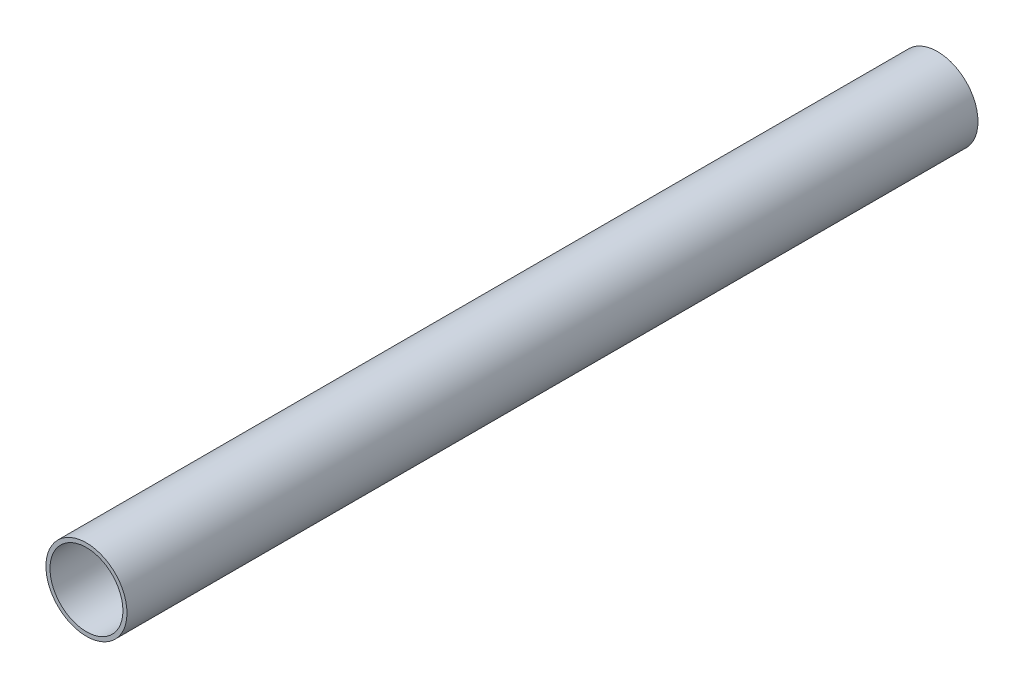
ISO-10303-21;
HEADER;
FILE_DESCRIPTION(('STEP AP214'),'2;1');
FILE_NAME('part.step','',(''),(''),'','','');
FILE_SCHEMA(('AUTOMOTIVE_DESIGN { 1 0 10303 214 1 1 1 1 }'));
ENDSEC;
DATA;
#1=APPLICATION_CONTEXT('core data for automotive mechanical design processes');
#2=APPLICATION_PROTOCOL_DEFINITION('international standard','automotive_design',2000,#1);
#3=PRODUCT_CONTEXT('',#1,'mechanical');
#4=PRODUCT('Part','Part','',(#3));
#5=PRODUCT_RELATED_PRODUCT_CATEGORY('part','',(#4));
#6=PRODUCT_DEFINITION_FORMATION('','',#4);
#7=PRODUCT_DEFINITION_CONTEXT('part definition',#1,'design');
#8=PRODUCT_DEFINITION('design','',#6,#7);
#9=PRODUCT_DEFINITION_SHAPE('','',#8);
#10=(LENGTH_UNIT() NAMED_UNIT(*) SI_UNIT(.MILLI.,.METRE.));
#11=(NAMED_UNIT(*) PLANE_ANGLE_UNIT() SI_UNIT($,.RADIAN.));
#12=(NAMED_UNIT(*) SI_UNIT($,.STERADIAN.) SOLID_ANGLE_UNIT());
#13=UNCERTAINTY_MEASURE_WITH_UNIT(LENGTH_MEASURE(1.E-05),#10,'distance_accuracy_value','');
#14=(GEOMETRIC_REPRESENTATION_CONTEXT(3) GLOBAL_UNCERTAINTY_ASSIGNED_CONTEXT((#13)) GLOBAL_UNIT_ASSIGNED_CONTEXT((#10,
#11,#12)) REPRESENTATION_CONTEXT('',''));
#15=CARTESIAN_POINT('',(0.,0.,0.));
#16=DIRECTION('',(0.,0.,1.));
#17=DIRECTION('',(1.,0.,0.));
#18=AXIS2_PLACEMENT_3D('',#15,#16,#17);
#19=CARTESIAN_POINT('',(0.,0.,210.));
#20=DIRECTION('',(0.,0.,1.));
#21=DIRECTION('',(1.,0.,0.));
#22=AXIS2_PLACEMENT_3D('',#19,#20,#21);
#23=PLANE('',#22);
#24=CARTESIAN_POINT('',(0.,0.,210.));
#25=DIRECTION('',(0.,0.,1.));
#26=DIRECTION('',(1.,0.,0.));
#27=AXIS2_PLACEMENT_3D('',#24,#25,#26);
#28=CIRCLE('',#27,10.);
#29=CARTESIAN_POINT('',(10.,0.,210.));
#30=VERTEX_POINT('',#29);
#31=EDGE_CURVE('E10',#30,#30,#28,.T.);
#32=ORIENTED_EDGE('',*,*,#31,.T.);
#33=EDGE_LOOP('',(#32));
#34=FACE_BOUND('',#33,.T.);
#35=CARTESIAN_POINT('',(0.,0.,210.));
#36=DIRECTION('',(0.,0.,1.));
#37=DIRECTION('',(1.,0.,0.));
#38=AXIS2_PLACEMENT_3D('',#35,#36,#37);
#39=CIRCLE('',#38,9.);
#40=CARTESIAN_POINT('',(9.,0.,210.));
#41=VERTEX_POINT('',#40);
#42=EDGE_CURVE('E45',#41,#41,#39,.T.);
#43=ORIENTED_EDGE('',*,*,#42,.F.);
#44=EDGE_LOOP('',(#43));
#45=FACE_BOUND('',#44,.T.);
#46=ADVANCED_FACE('F34',(#34,#45),#23,.T.);
#47=CARTESIAN_POINT('',(0.,0.,0.));
#48=DIRECTION('',(0.,0.,1.));
#49=DIRECTION('',(1.,0.,0.));
#50=AXIS2_PLACEMENT_3D('',#47,#48,#49);
#51=PLANE('',#50);
#52=CARTESIAN_POINT('',(0.,0.,0.));
#53=DIRECTION('',(0.,0.,1.));
#54=DIRECTION('',(1.,0.,0.));
#55=AXIS2_PLACEMENT_3D('',#52,#53,#54);
#56=CIRCLE('',#55,10.);
#57=CARTESIAN_POINT('',(10.,0.,0.));
#58=VERTEX_POINT('',#57);
#59=EDGE_CURVE('E38',#58,#58,#56,.T.);
#60=ORIENTED_EDGE('',*,*,#59,.F.);
#61=EDGE_LOOP('',(#60));
#62=FACE_BOUND('',#61,.T.);
#63=CARTESIAN_POINT('',(0.,0.,0.));
#64=DIRECTION('',(0.,0.,1.));
#65=DIRECTION('',(1.,0.,0.));
#66=AXIS2_PLACEMENT_3D('',#63,#64,#65);
#67=CIRCLE('',#66,9.);
#68=CARTESIAN_POINT('',(9.,0.,0.));
#69=VERTEX_POINT('',#68);
#70=EDGE_CURVE('E47',#69,#69,#67,.T.);
#71=ORIENTED_EDGE('',*,*,#70,.T.);
#72=EDGE_LOOP('',(#71));
#73=FACE_BOUND('',#72,.T.);
#74=ADVANCED_FACE('F57',(#62,#73),#51,.F.);
#75=CARTESIAN_POINT('',(0.,0.,210.));
#76=DIRECTION('',(0.,0.,-1.));
#77=DIRECTION('',(-1.,0.,0.));
#78=AXIS2_PLACEMENT_3D('',#75,#76,#77);
#79=CYLINDRICAL_SURFACE('',#78,10.);
#80=ORIENTED_EDGE('',*,*,#31,.F.);
#81=EDGE_LOOP('',(#80));
#82=FACE_BOUND('',#81,.T.);
#83=ORIENTED_EDGE('',*,*,#59,.T.);
#84=EDGE_LOOP('',(#83));
#85=FACE_BOUND('',#84,.T.);
#86=ADVANCED_FACE('F36',(#82,#85),#79,.T.);
#87=CARTESIAN_POINT('',(0.,0.,210.));
#88=DIRECTION('',(0.,0.,-1.));
#89=DIRECTION('',(-1.,0.,0.));
#90=AXIS2_PLACEMENT_3D('',#87,#88,#89);
#91=CYLINDRICAL_SURFACE('',#90,9.);
#92=ORIENTED_EDGE('',*,*,#42,.T.);
#93=EDGE_LOOP('',(#92));
#94=FACE_BOUND('',#93,.T.);
#95=ORIENTED_EDGE('',*,*,#70,.F.);
#96=EDGE_LOOP('',(#95));
#97=FACE_BOUND('',#96,.T.);
#98=ADVANCED_FACE('F53',(#94,#97),#91,.F.);
#99=CLOSED_SHELL('',(#46,#74,#86,#98));
#100=MANIFOLD_SOLID_BREP('B2',#99);
#101=ADVANCED_BREP_SHAPE_REPRESENTATION('',(#18,#100),#14);
#102=SHAPE_DEFINITION_REPRESENTATION(#9,#101);
ENDSEC;
END-ISO-10303-21;
